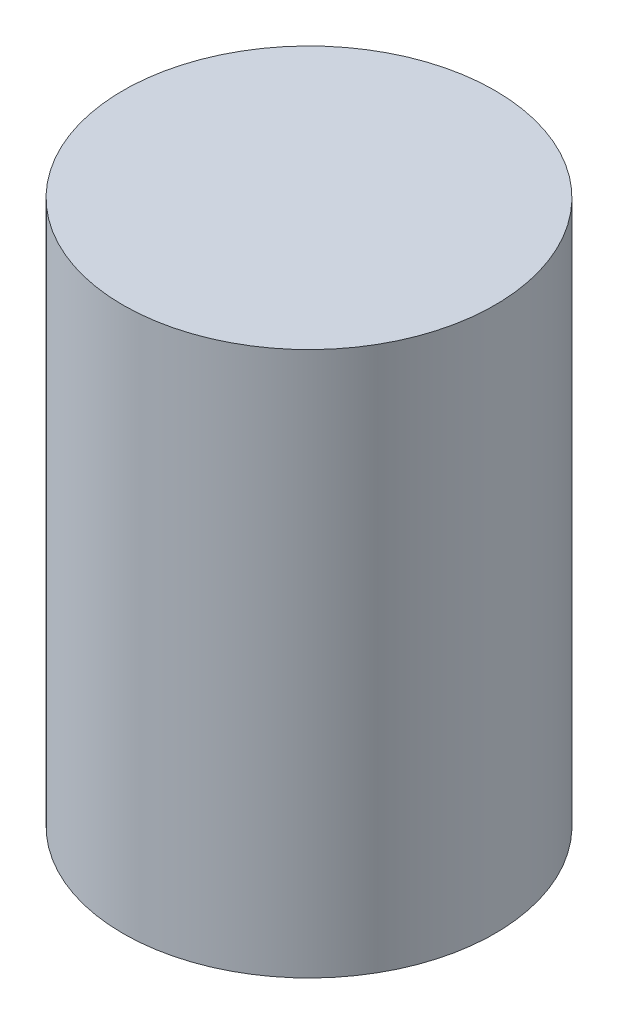
ISO-10303-21;
HEADER;
FILE_DESCRIPTION(('STEP AP214'),'2;1');
FILE_NAME('part.step','',(''),(''),'','','');
FILE_SCHEMA(('AUTOMOTIVE_DESIGN { 1 0 10303 214 1 1 1 1 }'));
ENDSEC;
DATA;
#1=APPLICATION_CONTEXT('core data for automotive mechanical design processes');
#2=APPLICATION_PROTOCOL_DEFINITION('international standard','automotive_design',2000,#1);
#3=PRODUCT_CONTEXT('',#1,'mechanical');
#4=PRODUCT('Part','Part','',(#3));
#5=PRODUCT_RELATED_PRODUCT_CATEGORY('part','',(#4));
#6=PRODUCT_DEFINITION_FORMATION('','',#4);
#7=PRODUCT_DEFINITION_CONTEXT('part definition',#1,'design');
#8=PRODUCT_DEFINITION('design','',#6,#7);
#9=PRODUCT_DEFINITION_SHAPE('','',#8);
#10=(LENGTH_UNIT() NAMED_UNIT(*) SI_UNIT(.MILLI.,.METRE.));
#11=(NAMED_UNIT(*) PLANE_ANGLE_UNIT() SI_UNIT($,.RADIAN.));
#12=(NAMED_UNIT(*) SI_UNIT($,.STERADIAN.) SOLID_ANGLE_UNIT());
#13=UNCERTAINTY_MEASURE_WITH_UNIT(LENGTH_MEASURE(1.E-05),#10,'distance_accuracy_value','');
#14=(GEOMETRIC_REPRESENTATION_CONTEXT(3) GLOBAL_UNCERTAINTY_ASSIGNED_CONTEXT((#13)) GLOBAL_UNIT_ASSIGNED_CONTEXT((#10,
#11,#12)) REPRESENTATION_CONTEXT('',''));
#15=CARTESIAN_POINT('',(0.,0.,0.));
#16=DIRECTION('',(0.,0.,1.));
#17=DIRECTION('',(1.,0.,0.));
#18=AXIS2_PLACEMENT_3D('',#15,#16,#17);
#19=CARTESIAN_POINT('',(0.,60.,0.));
#20=DIRECTION('',(0.,-1.,0.));
#21=DIRECTION('',(0.,0.,-1.));
#22=AXIS2_PLACEMENT_3D('',#19,#20,#21);
#23=CYLINDRICAL_SURFACE('',#22,20.5);
#24=CARTESIAN_POINT('',(0.,60.,0.));
#25=DIRECTION('',(0.,1.,0.));
#26=DIRECTION('',(0.,0.,1.));
#27=AXIS2_PLACEMENT_3D('',#24,#25,#26);
#28=CIRCLE('',#27,20.5);
#29=CARTESIAN_POINT('',(0.,60.,20.5));
#30=VERTEX_POINT('',#29);
#31=EDGE_CURVE('E10',#30,#30,#28,.T.);
#32=ORIENTED_EDGE('',*,*,#31,.F.);
#33=EDGE_LOOP('',(#32));
#34=FACE_BOUND('',#33,.T.);
#35=CARTESIAN_POINT('',(0.,0.,0.));
#36=DIRECTION('',(0.,1.,0.));
#37=DIRECTION('',(0.,0.,1.));
#38=AXIS2_PLACEMENT_3D('',#35,#36,#37);
#39=CIRCLE('',#38,20.5);
#40=CARTESIAN_POINT('',(0.,0.,20.5));
#41=VERTEX_POINT('',#40);
#42=EDGE_CURVE('E40',#41,#41,#39,.T.);
#43=ORIENTED_EDGE('',*,*,#42,.T.);
#44=EDGE_LOOP('',(#43));
#45=FACE_BOUND('',#44,.T.);
#46=ADVANCED_FACE('F37',(#34,#45),#23,.T.);
#47=CARTESIAN_POINT('',(0.,60.,0.));
#48=DIRECTION('',(0.,1.,0.));
#49=DIRECTION('',(0.,0.,1.));
#50=AXIS2_PLACEMENT_3D('',#47,#48,#49);
#51=PLANE('',#50);
#52=ORIENTED_EDGE('',*,*,#31,.T.);
#53=EDGE_LOOP('',(#52));
#54=FACE_BOUND('',#53,.T.);
#55=ADVANCED_FACE('F54',(#54),#51,.T.);
#56=CARTESIAN_POINT('',(0.,0.,0.));
#57=DIRECTION('',(0.,1.,0.));
#58=DIRECTION('',(0.,0.,1.));
#59=AXIS2_PLACEMENT_3D('',#56,#57,#58);
#60=PLANE('',#59);
#61=ORIENTED_EDGE('',*,*,#42,.F.);
#62=EDGE_LOOP('',(#61));
#63=FACE_BOUND('',#62,.T.);
#64=ADVANCED_FACE('F52',(#63),#60,.F.);
#65=CLOSED_SHELL('',(#46,#55,#64));
#66=MANIFOLD_SOLID_BREP('B2',#65);
#67=ADVANCED_BREP_SHAPE_REPRESENTATION('',(#18,#66),#14);
#68=SHAPE_DEFINITION_REPRESENTATION(#9,#67);
ENDSEC;
END-ISO-10303-21;
